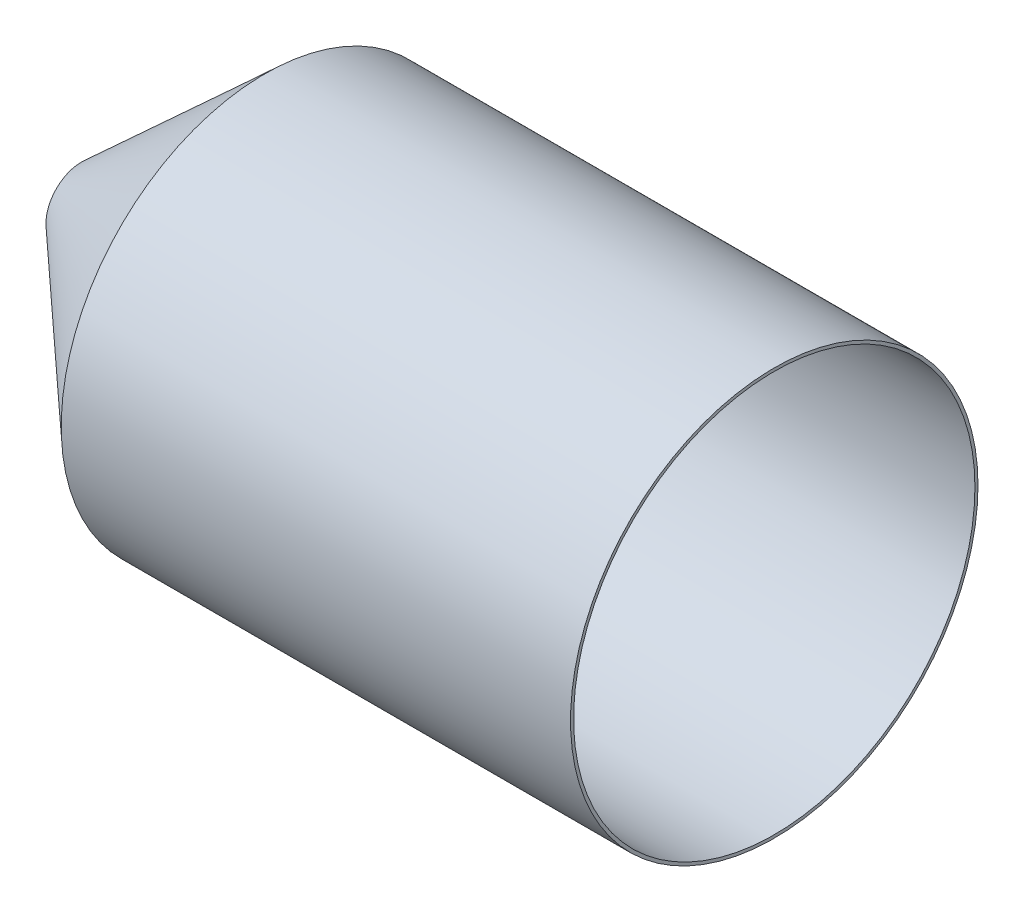
ISO-10303-21;
HEADER;
FILE_DESCRIPTION(('STEP AP214'),'2;1');
FILE_NAME('part.step','',(''),(''),'','','');
FILE_SCHEMA(('AUTOMOTIVE_DESIGN { 1 0 10303 214 1 1 1 1 }'));
ENDSEC;
DATA;
#1=APPLICATION_CONTEXT('core data for automotive mechanical design processes');
#2=APPLICATION_PROTOCOL_DEFINITION('international standard','automotive_design',2000,#1);
#3=PRODUCT_CONTEXT('',#1,'mechanical');
#4=PRODUCT('Part','Part','',(#3));
#5=PRODUCT_RELATED_PRODUCT_CATEGORY('part','',(#4));
#6=PRODUCT_DEFINITION_FORMATION('','',#4);
#7=PRODUCT_DEFINITION_CONTEXT('part definition',#1,'design');
#8=PRODUCT_DEFINITION('design','',#6,#7);
#9=PRODUCT_DEFINITION_SHAPE('','',#8);
#10=(LENGTH_UNIT() NAMED_UNIT(*) SI_UNIT(.MILLI.,.METRE.));
#11=(NAMED_UNIT(*) PLANE_ANGLE_UNIT() SI_UNIT($,.RADIAN.));
#12=(NAMED_UNIT(*) SI_UNIT($,.STERADIAN.) SOLID_ANGLE_UNIT());
#13=UNCERTAINTY_MEASURE_WITH_UNIT(LENGTH_MEASURE(1.E-05),#10,'distance_accuracy_value','');
#14=(GEOMETRIC_REPRESENTATION_CONTEXT(3) GLOBAL_UNCERTAINTY_ASSIGNED_CONTEXT((#13)) GLOBAL_UNIT_ASSIGNED_CONTEXT((#10,
#11,#12)) REPRESENTATION_CONTEXT('',''));
#15=CARTESIAN_POINT('',(0.,0.,0.));
#16=DIRECTION('',(0.,0.,1.));
#17=DIRECTION('',(1.,0.,0.));
#18=AXIS2_PLACEMENT_3D('',#15,#16,#17);
#19=CARTESIAN_POINT('',(-180.,0.,0.));
#20=DIRECTION('',(1.,0.,0.));
#21=DIRECTION('',(0.,0.,-1.));
#22=AXIS2_PLACEMENT_3D('',#19,#20,#21);
#23=CONICAL_SURFACE('',#22,35.,0.741947268005917);
#24=CARTESIAN_POINT('',(0.,0.,0.));
#25=DIRECTION('',(-1.,0.,0.));
#26=DIRECTION('',(0.,0.,1.));
#27=AXIS2_PLACEMENT_3D('',#24,#25,#26);
#28=CIRCLE('',#27,200.);
#29=CARTESIAN_POINT('',(0.,0.,-200.));
#30=VERTEX_POINT('',#29);
#31=EDGE_CURVE('E44',#30,#30,#28,.T.);
#32=CARTESIAN_POINT('',(-180.,0.,0.));
#33=DIRECTION('',(1.,0.,0.));
#34=DIRECTION('',(0.,0.,-1.));
#35=AXIS2_PLACEMENT_3D('',#32,#33,#34);
#36=CIRCLE('',#35,35.);
#37=CARTESIAN_POINT('',(-180.,0.,-35.));
#38=VERTEX_POINT('',#37);
#39=EDGE_CURVE('E11',#38,#38,#36,.T.);
#40=CARTESIAN_POINT('',(0.,0.,-200.));
#41=CARTESIAN_POINT('',(-1.87499999999999,0.,-198.28125));
#42=CARTESIAN_POINT('',(-3.74999999999999,0.,-196.5625));
#43=CARTESIAN_POINT('',(-7.5,0.,-193.125));
#44=CARTESIAN_POINT('',(-9.37500000000001,0.,-191.40625));
#45=CARTESIAN_POINT('',(-13.125,0.,-187.96875));
#46=CARTESIAN_POINT('',(-15.,0.,-186.25));
#47=CARTESIAN_POINT('',(-18.75,0.,-182.8125));
#48=CARTESIAN_POINT('',(-20.625,0.,-181.09375));
#49=CARTESIAN_POINT('',(-24.375,0.,-177.65625));
#50=CARTESIAN_POINT('',(-26.25,0.,-175.9375));
#51=CARTESIAN_POINT('',(-30.,0.,-172.5));
#52=CARTESIAN_POINT('',(-31.875,0.,-170.78125));
#53=CARTESIAN_POINT('',(-35.625,0.,-167.34375));
#54=CARTESIAN_POINT('',(-37.5,0.,-165.625));
#55=CARTESIAN_POINT('',(-41.25,0.,-162.1875));
#56=CARTESIAN_POINT('',(-43.125,0.,-160.46875));
#57=CARTESIAN_POINT('',(-46.875,0.,-157.03125));
#58=CARTESIAN_POINT('',(-48.75,0.,-155.3125));
#59=CARTESIAN_POINT('',(-52.5,0.,-151.875));
#60=CARTESIAN_POINT('',(-54.375,0.,-150.15625));
#61=CARTESIAN_POINT('',(-58.125,0.,-146.71875));
#62=CARTESIAN_POINT('',(-60.,0.,-145.));
#63=CARTESIAN_POINT('',(-63.75,0.,-141.5625));
#64=CARTESIAN_POINT('',(-65.625,0.,-139.84375));
#65=CARTESIAN_POINT('',(-69.375,0.,-136.40625));
#66=CARTESIAN_POINT('',(-71.25,0.,-134.6875));
#67=CARTESIAN_POINT('',(-75.,0.,-131.25));
#68=CARTESIAN_POINT('',(-76.875,0.,-129.53125));
#69=CARTESIAN_POINT('',(-80.625,0.,-126.09375));
#70=CARTESIAN_POINT('',(-82.5,0.,-124.375));
#71=CARTESIAN_POINT('',(-86.25,0.,-120.9375));
#72=CARTESIAN_POINT('',(-88.125,0.,-119.21875));
#73=CARTESIAN_POINT('',(-91.875,0.,-115.78125));
#74=CARTESIAN_POINT('',(-93.75,0.,-114.0625));
#75=CARTESIAN_POINT('',(-97.5,0.,-110.625));
#76=CARTESIAN_POINT('',(-99.375,0.,-108.90625));
#77=CARTESIAN_POINT('',(-103.125,0.,-105.46875));
#78=CARTESIAN_POINT('',(-105.,0.,-103.75));
#79=CARTESIAN_POINT('',(-108.75,0.,-100.3125));
#80=CARTESIAN_POINT('',(-110.625,0.,-98.59375));
#81=CARTESIAN_POINT('',(-114.375,0.,-95.15625));
#82=CARTESIAN_POINT('',(-116.25,0.,-93.4375));
#83=CARTESIAN_POINT('',(-120.,0.,-90.));
#84=CARTESIAN_POINT('',(-121.875,0.,-88.28125));
#85=CARTESIAN_POINT('',(-125.625,0.,-84.84375));
#86=CARTESIAN_POINT('',(-127.5,0.,-83.125));
#87=CARTESIAN_POINT('',(-131.25,0.,-79.6875));
#88=CARTESIAN_POINT('',(-133.125,0.,-77.96875));
#89=CARTESIAN_POINT('',(-136.875,0.,-74.53125));
#90=CARTESIAN_POINT('',(-138.75,0.,-72.8125));
#91=CARTESIAN_POINT('',(-142.5,0.,-69.375));
#92=CARTESIAN_POINT('',(-144.375,0.,-67.65625));
#93=CARTESIAN_POINT('',(-148.125,0.,-64.21875));
#94=CARTESIAN_POINT('',(-150.,0.,-62.5));
#95=CARTESIAN_POINT('',(-153.75,0.,-59.0625));
#96=CARTESIAN_POINT('',(-155.625,0.,-57.34375));
#97=CARTESIAN_POINT('',(-159.375,0.,-53.90625));
#98=CARTESIAN_POINT('',(-161.25,0.,-52.1875));
#99=CARTESIAN_POINT('',(-165.,0.,-48.75));
#100=CARTESIAN_POINT('',(-166.875,0.,-47.03125));
#101=CARTESIAN_POINT('',(-170.625,0.,-43.59375));
#102=CARTESIAN_POINT('',(-172.5,0.,-41.875));
#103=CARTESIAN_POINT('',(-176.25,0.,-38.4375));
#104=CARTESIAN_POINT('',(-178.125,0.,-36.71875));
#105=CARTESIAN_POINT('',(-180.,0.,-35.));
#106=B_SPLINE_CURVE_WITH_KNOTS('',3,(#40,#41,#42,#43,#44,#45,#46,#47,#48,#49,#50,#51,#52,#53,
#54,#55,#56,#57,#58,#59,#60,#61,#62,#63,#64,#65,#66,#67,#68,#69,#70,#71,#72,#73,#74,#75,#76,#77,
#78,#79,#80,#81,#82,#83,#84,#85,#86,#87,#88,#89,#90,#91,#92,#93,#94,#95,#96,#97,#98,#99,#100,
#101,#102,#103,#104,#105),.UNSPECIFIED.,.F.,.F.,(4,2,2,2,2,2,2,2,2,2,2,2,2,2,2,2,2,2,2,2,2,2,2,
2,2,2,2,2,2,2,2,2,4),(0.,7.63069715442173,15.2613943088435,22.8920914632652,30.5227886176869,
38.1534857721087,45.7841829265304,53.4148800809522,61.0455772353739,68.6762743897957,
76.3069715442174,83.9376686986391,91.5683658530609,99.1990630074826,106.829760161904,
114.460457316326,122.091154470748,129.72185162517,137.352548779591,144.983245934013,
152.613943088435,160.244640242857,167.875337397278,175.5060345517,183.136731706122,
190.767428860544,198.398126014965,206.028823169387,213.659520323809,221.29021747823,
228.920914632652,236.551611787074,244.182308941496),.UNSPECIFIED.);
#107=EDGE_CURVE('BSEAM40',#30,#38,#106,.T.);
#108=ORIENTED_EDGE('',*,*,#31,.T.);
#109=ORIENTED_EDGE('',*,*,#39,.T.);
#110=ORIENTED_EDGE('',*,*,#107,.T.);
#111=ORIENTED_EDGE('',*,*,#107,.F.);
#112=EDGE_LOOP('',(#108,#110,#109,#111));
#113=FACE_BOUND('',#112,.T.);
#114=ADVANCED_FACE('F40',(#113),#23,.T.);
#115=OPEN_SHELL('',(#114));
#116=SHELL_BASED_SURFACE_MODEL('B2',(#115));
#117=CARTESIAN_POINT('',(500.,0.,0.));
#118=DIRECTION('',(1.,0.,0.));
#119=DIRECTION('',(0.,0.,-1.));
#120=AXIS2_PLACEMENT_3D('',#117,#118,#119);
#121=PLANE('',#120);
#122=CARTESIAN_POINT('',(500.,0.,0.));
#123=DIRECTION('',(1.,0.,0.));
#124=DIRECTION('',(0.,0.,-1.));
#125=AXIS2_PLACEMENT_3D('',#122,#123,#124);
#126=CIRCLE('',#125,200.);
#127=CARTESIAN_POINT('',(500.,0.,-200.));
#128=VERTEX_POINT('',#127);
#129=EDGE_CURVE('E39',#128,#128,#126,.T.);
#130=ORIENTED_EDGE('',*,*,#129,.T.);
#131=EDGE_LOOP('',(#130));
#132=FACE_BOUND('',#131,.T.);
#133=CARTESIAN_POINT('',(500.,0.,0.));
#134=DIRECTION('',(1.,0.,0.));
#135=DIRECTION('',(0.,0.,-1.));
#136=AXIS2_PLACEMENT_3D('',#133,#134,#135);
#137=CIRCLE('',#136,197.);
#138=CARTESIAN_POINT('',(500.,0.,-197.));
#139=VERTEX_POINT('',#138);
#140=EDGE_CURVE('E75',#139,#139,#137,.T.);
#141=ORIENTED_EDGE('',*,*,#140,.F.);
#142=EDGE_LOOP('',(#141));
#143=FACE_BOUND('',#142,.T.);
#144=ADVANCED_FACE('F64',(#132,#143),#121,.T.);
#145=CARTESIAN_POINT('',(0.,0.,0.));
#146=DIRECTION('',(1.,0.,0.));
#147=DIRECTION('',(0.,0.,-1.));
#148=AXIS2_PLACEMENT_3D('',#145,#146,#147);
#149=PLANE('',#148);
#150=CARTESIAN_POINT('',(0.,0.,0.));
#151=DIRECTION('',(1.,0.,0.));
#152=DIRECTION('',(0.,0.,-1.));
#153=AXIS2_PLACEMENT_3D('',#150,#151,#152);
#154=CIRCLE('',#153,200.);
#155=CARTESIAN_POINT('',(0.,0.,-200.));
#156=VERTEX_POINT('',#155);
#157=EDGE_CURVE('E68',#156,#156,#154,.T.);
#158=ORIENTED_EDGE('',*,*,#157,.F.);
#159=EDGE_LOOP('',(#158));
#160=FACE_BOUND('',#159,.T.);
#161=CARTESIAN_POINT('',(0.,0.,0.));
#162=DIRECTION('',(1.,0.,0.));
#163=DIRECTION('',(0.,0.,-1.));
#164=AXIS2_PLACEMENT_3D('',#161,#162,#163);
#165=CIRCLE('',#164,197.);
#166=CARTESIAN_POINT('',(0.,0.,-197.));
#167=VERTEX_POINT('',#166);
#168=EDGE_CURVE('E77',#167,#167,#165,.T.);
#169=ORIENTED_EDGE('',*,*,#168,.T.);
#170=EDGE_LOOP('',(#169));
#171=FACE_BOUND('',#170,.T.);
#172=ADVANCED_FACE('F87',(#160,#171),#149,.F.);
#173=CARTESIAN_POINT('',(500.,0.,0.));
#174=DIRECTION('',(-1.,0.,0.));
#175=DIRECTION('',(0.,0.,1.));
#176=AXIS2_PLACEMENT_3D('',#173,#174,#175);
#177=CYLINDRICAL_SURFACE('',#176,200.);
#178=ORIENTED_EDGE('',*,*,#129,.F.);
#179=EDGE_LOOP('',(#178));
#180=FACE_BOUND('',#179,.T.);
#181=ORIENTED_EDGE('',*,*,#157,.T.);
#182=EDGE_LOOP('',(#181));
#183=FACE_BOUND('',#182,.T.);
#184=ADVANCED_FACE('F66',(#180,#183),#177,.T.);
#185=CARTESIAN_POINT('',(500.,0.,0.));
#186=DIRECTION('',(-1.,0.,0.));
#187=DIRECTION('',(0.,0.,1.));
#188=AXIS2_PLACEMENT_3D('',#185,#186,#187);
#189=CYLINDRICAL_SURFACE('',#188,197.);
#190=ORIENTED_EDGE('',*,*,#140,.T.);
#191=EDGE_LOOP('',(#190));
#192=FACE_BOUND('',#191,.T.);
#193=ORIENTED_EDGE('',*,*,#168,.F.);
#194=EDGE_LOOP('',(#193));
#195=FACE_BOUND('',#194,.T.);
#196=ADVANCED_FACE('F83',(#192,#195),#189,.F.);
#197=CLOSED_SHELL('',(#144,#172,#184,#196));
#198=MANIFOLD_SOLID_BREP('B6',#197);
#199=ADVANCED_BREP_SHAPE_REPRESENTATION('',(#18,#198),#14);
#200=MANIFOLD_SURFACE_SHAPE_REPRESENTATION('',(#18,#116),#14);
#201=SHAPE_REPRESENTATION('',(#18),#14);
#202=SHAPE_DEFINITION_REPRESENTATION(#9,#201);
#203=SHAPE_REPRESENTATION_RELATIONSHIP('','',#201,#199);
#204=SHAPE_REPRESENTATION_RELATIONSHIP('','',#201,#200);
ENDSEC;
END-ISO-10303-21;
